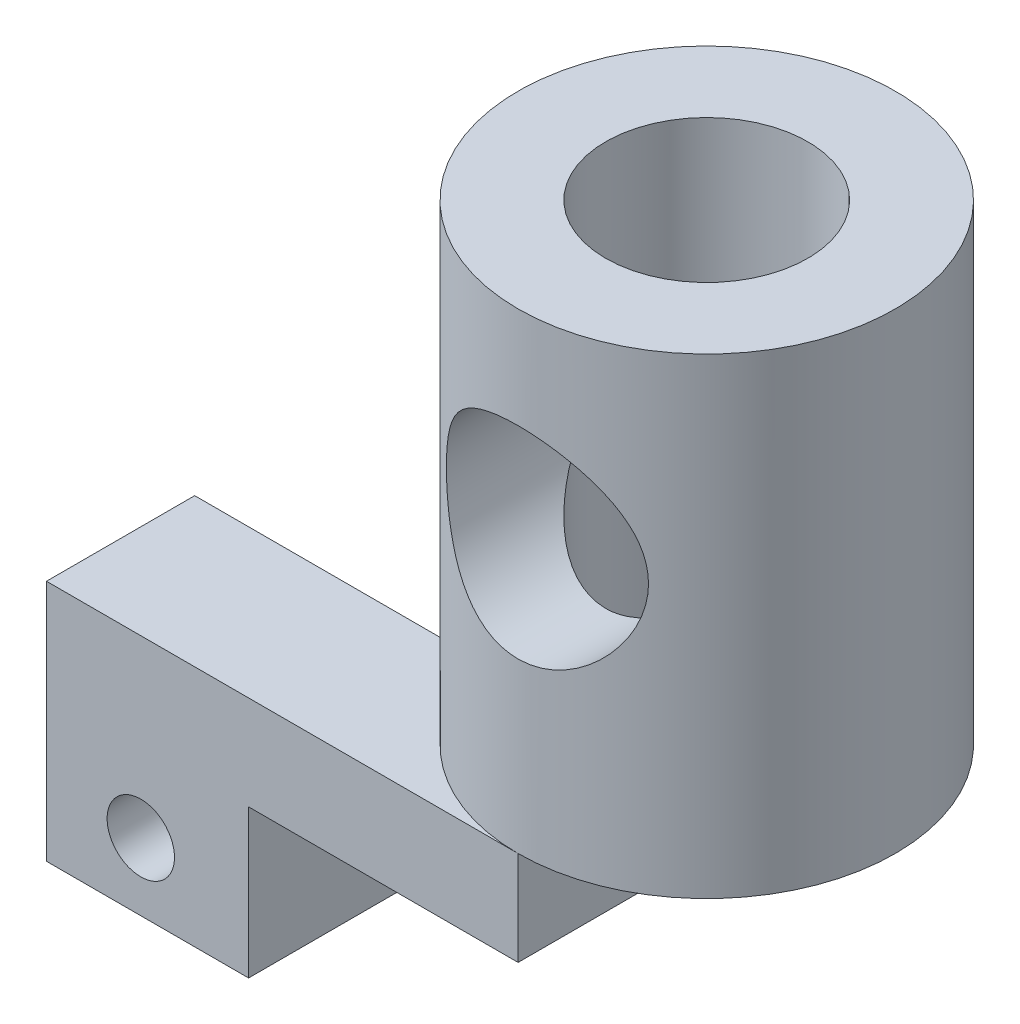
ISO-10303-21;
HEADER;
FILE_DESCRIPTION(('STEP AP214'),'2;1');
FILE_NAME('part.step','',(''),(''),'','','');
FILE_SCHEMA(('AUTOMOTIVE_DESIGN { 1 0 10303 214 1 1 1 1 }'));
ENDSEC;
DATA;
#1=APPLICATION_CONTEXT('core data for automotive mechanical design processes');
#2=APPLICATION_PROTOCOL_DEFINITION('international standard','automotive_design',2000,#1);
#3=PRODUCT_CONTEXT('',#1,'mechanical');
#4=PRODUCT('Part','Part','',(#3));
#5=PRODUCT_RELATED_PRODUCT_CATEGORY('part','',(#4));
#6=PRODUCT_DEFINITION_FORMATION('','',#4);
#7=PRODUCT_DEFINITION_CONTEXT('part definition',#1,'design');
#8=PRODUCT_DEFINITION('design','',#6,#7);
#9=PRODUCT_DEFINITION_SHAPE('','',#8);
#10=(LENGTH_UNIT() NAMED_UNIT(*) SI_UNIT(.MILLI.,.METRE.));
#11=(NAMED_UNIT(*) PLANE_ANGLE_UNIT() SI_UNIT($,.RADIAN.));
#12=(NAMED_UNIT(*) SI_UNIT($,.STERADIAN.) SOLID_ANGLE_UNIT());
#13=UNCERTAINTY_MEASURE_WITH_UNIT(LENGTH_MEASURE(1.E-05),#10,'distance_accuracy_value','');
#14=(GEOMETRIC_REPRESENTATION_CONTEXT(3) GLOBAL_UNCERTAINTY_ASSIGNED_CONTEXT((#13)) GLOBAL_UNIT_ASSIGNED_CONTEXT((#10,
#11,#12)) REPRESENTATION_CONTEXT('',''));
#15=CARTESIAN_POINT('',(0.,0.,0.));
#16=DIRECTION('',(0.,0.,1.));
#17=DIRECTION('',(1.,0.,0.));
#18=AXIS2_PLACEMENT_3D('',#15,#16,#17);
#19=CARTESIAN_POINT('',(0.,0.,14.));
#20=DIRECTION('',(0.,-1.,0.));
#21=DIRECTION('',(0.,0.,-1.));
#22=AXIS2_PLACEMENT_3D('',#19,#20,#21);
#23=PLANE('',#22);
#24=DIRECTION('',(-1.,0.,0.));
#25=VECTOR('',#24,1.);
#26=CARTESIAN_POINT('',(0.,0.,3.));
#27=LINE('',#26,#25);
#28=CARTESIAN_POINT('',(35.,0.,3.));
#29=VERTEX_POINT('',#28);
#30=CARTESIAN_POINT('',(28.1261364575662,0.,3.));
#31=VERTEX_POINT('',#30);
#32=EDGE_CURVE('E196',#29,#31,#27,.T.);
#33=ORIENTED_EDGE('',*,*,#32,.T.);
#34=CARTESIAN_POINT('',(35.,0.,0.));
#35=DIRECTION('',(0.,1.,0.));
#36=DIRECTION('',(0.,0.,1.));
#37=AXIS2_PLACEMENT_3D('',#34,#35,#36);
#38=CIRCLE('',#37,7.5);
#39=CARTESIAN_POINT('',(35.,0.,7.5));
#40=VERTEX_POINT('',#39);
#41=EDGE_CURVE('E63',#31,#40,#38,.T.);
#42=ORIENTED_EDGE('',*,*,#41,.T.);
#43=DIRECTION('',(0.,0.,-1.));
#44=VECTOR('',#43,1.);
#45=CARTESIAN_POINT('',(35.,0.,14.));
#46=LINE('',#45,#44);
#47=EDGE_CURVE('E218',#40,#29,#46,.T.);
#48=ORIENTED_EDGE('',*,*,#47,.T.);
#49=EDGE_LOOP('',(#33,#42,#48));
#50=FACE_BOUND('',#49,.T.);
#51=ADVANCED_FACE('F39',(#50),#23,.F.);
#52=CARTESIAN_POINT('',(0.,-18.,14.));
#53=DIRECTION('',(1.,0.,0.));
#54=DIRECTION('',(0.,1.,0.));
#55=AXIS2_PLACEMENT_3D('',#52,#53,#54);
#56=PLANE('',#55);
#57=DIRECTION('',(0.,-1.,0.));
#58=VECTOR('',#57,1.);
#59=CARTESIAN_POINT('',(0.,-18.,3.));
#60=LINE('',#59,#58);
#61=CARTESIAN_POINT('',(0.,0.,3.));
#62=VERTEX_POINT('',#61);
#63=CARTESIAN_POINT('',(0.,-18.,3.));
#64=VERTEX_POINT('',#63);
#65=EDGE_CURVE('E55',#62,#64,#60,.T.);
#66=ORIENTED_EDGE('',*,*,#65,.T.);
#67=DIRECTION('',(0.,0.,-1.));
#68=VECTOR('',#67,1.);
#69=CARTESIAN_POINT('',(0.,-18.,14.));
#70=LINE('',#69,#68);
#71=CARTESIAN_POINT('',(0.,-18.,14.));
#72=VERTEX_POINT('',#71);
#73=EDGE_CURVE('E124',#72,#64,#70,.T.);
#74=ORIENTED_EDGE('',*,*,#73,.F.);
#75=DIRECTION('',(0.,-1.,0.));
#76=VECTOR('',#75,1.);
#77=CARTESIAN_POINT('',(0.,-18.,14.));
#78=LINE('',#77,#76);
#79=CARTESIAN_POINT('',(0.,0.,14.));
#80=VERTEX_POINT('',#79);
#81=EDGE_CURVE('E203',#80,#72,#78,.T.);
#82=ORIENTED_EDGE('',*,*,#81,.F.);
#83=DIRECTION('',(0.,0.,-1.));
#84=VECTOR('',#83,1.);
#85=CARTESIAN_POINT('',(0.,0.,14.));
#86=LINE('',#85,#84);
#87=EDGE_CURVE('E126',#80,#62,#86,.T.);
#88=ORIENTED_EDGE('',*,*,#87,.T.);
#89=EDGE_LOOP('',(#66,#74,#82,#88));
#90=FACE_BOUND('',#89,.T.);
#91=ADVANCED_FACE('F122',(#90),#56,.F.);
#92=CARTESIAN_POINT('',(15.,-18.,14.));
#93=DIRECTION('',(0.,1.,0.));
#94=DIRECTION('',(-1.,0.,0.));
#95=AXIS2_PLACEMENT_3D('',#92,#93,#94);
#96=PLANE('',#95);
#97=DIRECTION('',(1.,0.,0.));
#98=VECTOR('',#97,1.);
#99=CARTESIAN_POINT('',(15.,-18.,3.));
#100=LINE('',#99,#98);
#101=CARTESIAN_POINT('',(15.,-18.,3.));
#102=VERTEX_POINT('',#101);
#103=EDGE_CURVE('E109',#64,#102,#100,.T.);
#104=ORIENTED_EDGE('',*,*,#103,.T.);
#105=DIRECTION('',(0.,0.,-1.));
#106=VECTOR('',#105,1.);
#107=CARTESIAN_POINT('',(15.,-18.,14.));
#108=LINE('',#107,#106);
#109=CARTESIAN_POINT('',(15.,-18.,14.));
#110=VERTEX_POINT('',#109);
#111=EDGE_CURVE('E133',#110,#102,#108,.T.);
#112=ORIENTED_EDGE('',*,*,#111,.F.);
#113=DIRECTION('',(1.,0.,0.));
#114=VECTOR('',#113,1.);
#115=CARTESIAN_POINT('',(15.,-18.,14.));
#116=LINE('',#115,#114);
#117=EDGE_CURVE('E130',#72,#110,#116,.T.);
#118=ORIENTED_EDGE('',*,*,#117,.F.);
#119=ORIENTED_EDGE('',*,*,#73,.T.);
#120=EDGE_LOOP('',(#104,#112,#118,#119));
#121=FACE_BOUND('',#120,.T.);
#122=ADVANCED_FACE('F129',(#121),#96,.F.);
#123=CARTESIAN_POINT('',(15.,-7.,14.));
#124=DIRECTION('',(-1.,0.,0.));
#125=DIRECTION('',(0.,-1.,0.));
#126=AXIS2_PLACEMENT_3D('',#123,#124,#125);
#127=PLANE('',#126);
#128=DIRECTION('',(0.,1.,0.));
#129=VECTOR('',#128,1.);
#130=CARTESIAN_POINT('',(15.,-7.,3.));
#131=LINE('',#130,#129);
#132=CARTESIAN_POINT('',(15.,-7.,3.));
#133=VERTEX_POINT('',#132);
#134=EDGE_CURVE('E113',#102,#133,#131,.T.);
#135=ORIENTED_EDGE('',*,*,#134,.T.);
#136=DIRECTION('',(0.,0.,-1.));
#137=VECTOR('',#136,1.);
#138=CARTESIAN_POINT('',(15.,-7.,14.));
#139=LINE('',#138,#137);
#140=CARTESIAN_POINT('',(15.,-7.,14.));
#141=VERTEX_POINT('',#140);
#142=EDGE_CURVE('E137',#141,#133,#139,.T.);
#143=ORIENTED_EDGE('',*,*,#142,.F.);
#144=DIRECTION('',(0.,1.,0.));
#145=VECTOR('',#144,1.);
#146=CARTESIAN_POINT('',(15.,-7.,14.));
#147=LINE('',#146,#145);
#148=EDGE_CURVE('E208',#110,#141,#147,.T.);
#149=ORIENTED_EDGE('',*,*,#148,.F.);
#150=ORIENTED_EDGE('',*,*,#111,.T.);
#151=EDGE_LOOP('',(#135,#143,#149,#150));
#152=FACE_BOUND('',#151,.T.);
#153=ADVANCED_FACE('F232',(#152),#127,.F.);
#154=CARTESIAN_POINT('',(35.,-7.,14.));
#155=DIRECTION('',(0.,1.,0.));
#156=DIRECTION('',(-1.,0.,0.));
#157=AXIS2_PLACEMENT_3D('',#154,#155,#156);
#158=PLANE('',#157);
#159=DIRECTION('',(1.,0.,0.));
#160=VECTOR('',#159,1.);
#161=CARTESIAN_POINT('',(35.,-7.,3.));
#162=LINE('',#161,#160);
#163=CARTESIAN_POINT('',(35.,-7.,3.));
#164=VERTEX_POINT('',#163);
#165=EDGE_CURVE('E198',#133,#164,#162,.T.);
#166=ORIENTED_EDGE('',*,*,#165,.T.);
#167=DIRECTION('',(0.,0.,-1.));
#168=VECTOR('',#167,1.);
#169=CARTESIAN_POINT('',(35.,-7.,14.));
#170=LINE('',#169,#168);
#171=CARTESIAN_POINT('',(35.,-7.,14.));
#172=VERTEX_POINT('',#171);
#173=EDGE_CURVE('E222',#172,#164,#170,.T.);
#174=ORIENTED_EDGE('',*,*,#173,.F.);
#175=DIRECTION('',(1.,0.,0.));
#176=VECTOR('',#175,1.);
#177=CARTESIAN_POINT('',(35.,-7.,14.));
#178=LINE('',#177,#176);
#179=EDGE_CURVE('E210',#141,#172,#178,.T.);
#180=ORIENTED_EDGE('',*,*,#179,.F.);
#181=ORIENTED_EDGE('',*,*,#142,.T.);
#182=EDGE_LOOP('',(#166,#174,#180,#181));
#183=FACE_BOUND('',#182,.T.);
#184=ADVANCED_FACE('F185',(#183),#158,.F.);
#185=CARTESIAN_POINT('',(35.,0.,14.));
#186=DIRECTION('',(-1.,0.,0.));
#187=DIRECTION('',(0.,0.,1.));
#188=AXIS2_PLACEMENT_3D('',#185,#186,#187);
#189=PLANE('',#188);
#190=DIRECTION('',(0.,1.,0.));
#191=VECTOR('',#190,1.);
#192=CARTESIAN_POINT('',(35.,0.,3.));
#193=LINE('',#192,#191);
#194=EDGE_CURVE('E194',#164,#29,#193,.T.);
#195=ORIENTED_EDGE('',*,*,#194,.T.);
#196=ORIENTED_EDGE('',*,*,#47,.F.);
#197=CARTESIAN_POINT('',(35.,0.,14.));
#198=VERTEX_POINT('',#197);
#199=EDGE_CURVE('E219',#198,#40,#46,.T.);
#200=ORIENTED_EDGE('',*,*,#199,.F.);
#201=DIRECTION('',(0.,1.,0.));
#202=VECTOR('',#201,1.);
#203=CARTESIAN_POINT('',(35.,0.,14.));
#204=LINE('',#203,#202);
#205=EDGE_CURVE('E212',#172,#198,#204,.T.);
#206=ORIENTED_EDGE('',*,*,#205,.F.);
#207=ORIENTED_EDGE('',*,*,#173,.T.);
#208=EDGE_LOOP('',(#195,#196,#200,#206,#207));
#209=FACE_BOUND('',#208,.T.);
#210=ADVANCED_FACE('F177',(#209),#189,.F.);
#211=CARTESIAN_POINT('',(21.3252056688227,0.,3.));
#212=VERTEX_POINT('',#211);
#213=EDGE_CURVE('E188',#212,#62,#27,.T.);
#214=ORIENTED_EDGE('',*,*,#213,.T.);
#215=ORIENTED_EDGE('',*,*,#87,.F.);
#216=DIRECTION('',(-1.,0.,0.));
#217=VECTOR('',#216,1.);
#218=CARTESIAN_POINT('',(0.,0.,14.));
#219=LINE('',#218,#217);
#220=EDGE_CURVE('E215',#198,#80,#219,.T.);
#221=ORIENTED_EDGE('',*,*,#220,.F.);
#222=CARTESIAN_POINT('',(35.,0.,0.));
#223=DIRECTION('',(0.,1.,0.));
#224=DIRECTION('',(0.,0.,1.));
#225=AXIS2_PLACEMENT_3D('',#222,#223,#224);
#226=CIRCLE('',#225,14.);
#227=EDGE_CURVE('E190',#212,#198,#226,.T.);
#228=ORIENTED_EDGE('',*,*,#227,.F.);
#229=EDGE_LOOP('',(#214,#215,#221,#228));
#230=FACE_BOUND('',#229,.T.);
#231=ADVANCED_FACE('F169',(#230),#23,.F.);
#232=CARTESIAN_POINT('',(7.,-13.,14.));
#233=DIRECTION('',(0.,0.,-1.));
#234=DIRECTION('',(-1.,0.,0.));
#235=AXIS2_PLACEMENT_3D('',#232,#233,#234);
#236=CYLINDRICAL_SURFACE('',#235,2.5);
#237=CARTESIAN_POINT('',(7.,-13.,14.));
#238=DIRECTION('',(0.,0.,1.));
#239=DIRECTION('',(1.,0.,0.));
#240=AXIS2_PLACEMENT_3D('',#237,#238,#239);
#241=CIRCLE('',#240,2.5);
#242=CARTESIAN_POINT('',(9.5,-13.,14.));
#243=VERTEX_POINT('',#242);
#244=EDGE_CURVE('E201',#243,#243,#241,.T.);
#245=ORIENTED_EDGE('',*,*,#244,.T.);
#246=EDGE_LOOP('',(#245));
#247=FACE_BOUND('',#246,.T.);
#248=CARTESIAN_POINT('',(7.,-13.,3.));
#249=DIRECTION('',(0.,0.,1.));
#250=DIRECTION('',(1.,0.,0.));
#251=AXIS2_PLACEMENT_3D('',#248,#249,#250);
#252=CIRCLE('',#251,2.5);
#253=CARTESIAN_POINT('',(9.5,-13.,3.));
#254=VERTEX_POINT('',#253);
#255=EDGE_CURVE('E127',#254,#254,#252,.T.);
#256=ORIENTED_EDGE('',*,*,#255,.F.);
#257=EDGE_LOOP('',(#256));
#258=FACE_BOUND('',#257,.T.);
#259=ADVANCED_FACE('F176',(#247,#258),#236,.F.);
#260=CARTESIAN_POINT('',(35.,35.,0.));
#261=DIRECTION('',(0.,-1.,0.));
#262=DIRECTION('',(0.,0.,-1.));
#263=AXIS2_PLACEMENT_3D('',#260,#261,#262);
#264=CYLINDRICAL_SURFACE('',#263,14.);
#265=CARTESIAN_POINT('',(35.,35.,0.));
#266=DIRECTION('',(0.,1.,0.));
#267=DIRECTION('',(0.,0.,1.));
#268=AXIS2_PLACEMENT_3D('',#265,#266,#267);
#269=CIRCLE('',#268,14.);
#270=CARTESIAN_POINT('',(35.,35.,14.));
#271=VERTEX_POINT('',#270);
#272=EDGE_CURVE('E254',#271,#271,#269,.T.);
#273=ORIENTED_EDGE('',*,*,#272,.F.);
#274=EDGE_LOOP('',(#273));
#275=FACE_BOUND('',#274,.T.);
#276=EDGE_CURVE('E251',#198,#212,#226,.T.);
#277=ORIENTED_EDGE('',*,*,#276,.T.);
#278=ORIENTED_EDGE('',*,*,#227,.T.);
#279=EDGE_LOOP('',(#277,#278));
#280=FACE_BOUND('',#279,.T.);
#281=CARTESIAN_POINT('',(27.5,20.,11.8215904175369));
#282=CARTESIAN_POINT('',(27.4999990589855,19.806768604071,11.82158924254));
#283=CARTESIAN_POINT('',(27.5074767769572,19.613547850116,11.8263437300954));
#284=CARTESIAN_POINT('',(27.5372741725406,19.2286413534503,11.8451692310046));
#285=CARTESIAN_POINT('',(27.5595993310484,19.0369562040593,11.8592436847926));
#286=CARTESIAN_POINT('',(27.6188052002818,18.6564645448089,11.8961832266942));
#287=CARTESIAN_POINT('',(27.6557047525107,18.4676620911177,11.9190596928911));
#288=CARTESIAN_POINT('',(27.7435801030353,18.0944435994979,11.9727614449499));
#289=CARTESIAN_POINT('',(27.7945621439531,17.9100295463716,12.0035902556023));
#290=CARTESIAN_POINT('',(27.9096257428336,17.5479711712402,12.0719109087049));
#291=CARTESIAN_POINT('',(27.9736207952273,17.3702908908122,12.1093585471128));
#292=CARTESIAN_POINT('',(28.1143081233628,17.021297726479,12.1899064259315));
#293=CARTESIAN_POINT('',(28.1910050511526,16.8499872037439,12.2330087361532));
#294=CARTESIAN_POINT('',(28.3564652536056,16.5145441012143,12.3236491146825));
#295=CARTESIAN_POINT('',(28.4452268950537,16.350410553832,12.3711865823247));
#296=CARTESIAN_POINT('',(28.6341993428717,16.0299586373999,12.4694811555299));
#297=CARTESIAN_POINT('',(28.7344105391963,15.8736405347933,12.5202383707265));
#298=CARTESIAN_POINT('',(29.0717182167373,15.388058321219,12.6854923670964));
#299=CARTESIAN_POINT('',(29.3298519664732,15.0742469605895,12.8039916210198));
#300=CARTESIAN_POINT('',(29.7523158616945,14.6378192754687,12.9801872692607));
#301=CARTESIAN_POINT('',(29.8991176026319,14.4979812944868,13.0386965132516));
#302=CARTESIAN_POINT('',(30.2040457785556,14.2302564242928,13.1539097894118));
#303=CARTESIAN_POINT('',(30.3621740446301,14.1023714751896,13.2106135275464));
#304=CARTESIAN_POINT('',(30.7021993160464,13.8496059299829,13.3253012106534));
#305=CARTESIAN_POINT('',(30.8849847852584,13.7257987968556,13.383019797524));
#306=CARTESIAN_POINT('',(31.2618647469785,13.4942157668861,13.4931411587737));
#307=CARTESIAN_POINT('',(31.4559542839235,13.3864329177308,13.5455462353213));
#308=CARTESIAN_POINT('',(31.8542699723965,13.1879609310866,13.643549014948));
#309=CARTESIAN_POINT('',(32.0584930345612,13.0972666238495,13.6891487759491));
#310=CARTESIAN_POINT('',(32.4756702444358,12.9340316131421,13.7721809250184));
#311=CARTESIAN_POINT('',(32.6886232972417,12.8614886412125,13.8096143335998));
#312=CARTESIAN_POINT('',(33.104263666187,12.7405767285424,13.8725189382145));
#313=CARTESIAN_POINT('',(33.3064167351534,12.6907420611251,13.8987056736891));
#314=CARTESIAN_POINT('',(33.7150761523742,12.6079486304493,13.9424238900049));
#315=CARTESIAN_POINT('',(33.9215822882778,12.5749890459671,13.9599557920311));
#316=CARTESIAN_POINT('',(34.3370734436854,12.5264298080594,13.9858438958024));
#317=CARTESIAN_POINT('',(34.5460569078964,12.5108197910713,13.9942055752339));
#318=CARTESIAN_POINT('',(34.964755415329,12.4971591504375,14.0015208025305));
#319=CARTESIAN_POINT('',(35.1744704035491,12.4991072339266,14.0004750430987));
#320=CARTESIAN_POINT('',(35.5718439966255,12.5194559644125,13.9895847286427));
#321=CARTESIAN_POINT('',(35.7596149223951,12.5361951265238,13.9806287712972));
#322=CARTESIAN_POINT('',(36.1329398587043,12.5836759626681,13.9553379454909));
#323=CARTESIAN_POINT('',(36.3184931070116,12.6144223166639,13.9390006108427));
#324=CARTESIAN_POINT('',(36.6859801272297,12.6895530307173,13.8993387899878));
#325=CARTESIAN_POINT('',(36.867915141698,12.7339326196912,13.8760167482191));
#326=CARTESIAN_POINT('',(37.2271525964881,12.8358761054452,13.8229077838052));
#327=CARTESIAN_POINT('',(37.40445320132,12.8934451404222,13.7931183419));
#328=CARTESIAN_POINT('',(37.7553308774444,13.0219308811495,13.727358255508));
#329=CARTESIAN_POINT('',(37.9288424994014,13.0929922052302,13.6913210457523));
#330=CARTESIAN_POINT('',(38.2691449660572,13.2473975734341,13.614080460369));
#331=CARTESIAN_POINT('',(38.4359335289464,13.3307457437574,13.5728753499402));
#332=CARTESIAN_POINT('',(38.9249515325987,13.5982271432735,13.442778576015));
#333=CARTESIAN_POINT('',(39.2360465952592,13.7998761545197,13.3473639029725));
#334=CARTESIAN_POINT('',(39.8538570350863,14.2680183574708,13.1361160826789));
#335=CARTESIAN_POINT('',(40.1567390392609,14.5390786336004,13.0191913143723));
#336=CARTESIAN_POINT('',(40.5751397685995,14.9791519876798,12.8429309636078));
#337=CARTESIAN_POINT('',(40.7087140317334,15.1315618250788,12.7839834665736));
#338=CARTESIAN_POINT('',(40.9633405408786,15.44701885264,12.6672079013068));
#339=CARTESIAN_POINT('',(41.0843906442649,15.6100678551886,12.6093800259894));
#340=CARTESIAN_POINT('',(41.3225004536957,15.9596697185115,12.4917984687544));
#341=CARTESIAN_POINT('',(41.4384466862298,16.1470571112161,12.4322669574827));
#342=CARTESIAN_POINT('',(41.6539166620692,16.5324222806281,12.3182890354374));
#343=CARTESIAN_POINT('',(41.7534478095067,16.7303952289961,12.2638403368637));
#344=CARTESIAN_POINT('',(41.9350988816375,17.1357895217505,12.1620412127541));
#345=CARTESIAN_POINT('',(42.0172301104651,17.3432046248093,12.1146861845968));
#346=CARTESIAN_POINT('',(42.1631143169955,17.7662093238331,12.0290051636502));
#347=CARTESIAN_POINT('',(42.2268701463449,17.9817976455281,11.9906777700466));
#348=CARTESIAN_POINT('',(42.3306340287287,18.401656291435,11.927497288373));
#349=CARTESIAN_POINT('',(42.3721480542369,18.6054276580469,11.9018038661284));
#350=CARTESIAN_POINT('',(42.4381824659351,19.0167351134861,11.8606478148504));
#351=CARTESIAN_POINT('',(42.4627039036103,19.2242709685548,11.8451845527873));
#352=CARTESIAN_POINT('',(42.4943155215533,19.6410176388,11.8252098231004));
#353=CARTESIAN_POINT('',(42.5014204786644,19.8502268828817,11.8206890714514));
#354=CARTESIAN_POINT('',(42.4981101201728,20.2684399473694,11.8227895612752));
#355=CARTESIAN_POINT('',(42.4876964678092,20.477443785392,11.8294097450135));
#356=CARTESIAN_POINT('',(42.4521223529846,20.8651652858596,11.8518450685446));
#357=CARTESIAN_POINT('',(42.4291390173972,21.0441676631644,11.8663004138869));
#358=CARTESIAN_POINT('',(42.3704960958227,21.3993544907123,11.9028140107268));
#359=CARTESIAN_POINT('',(42.3348324101323,21.5755380103122,11.9248747210564));
#360=CARTESIAN_POINT('',(42.2512479929245,21.9239274455067,11.975883814004));
#361=CARTESIAN_POINT('',(42.2033281035326,22.0961336334984,12.004831723392));
#362=CARTESIAN_POINT('',(42.095698568208,22.4357353241165,12.0687603692438));
#363=CARTESIAN_POINT('',(42.035984207681,22.603128872238,12.1037435174586));
#364=CARTESIAN_POINT('',(41.9024448246756,22.9394567929921,12.1804119466031));
#365=CARTESIAN_POINT('',(41.8281181140534,23.1081401695489,12.222322929887));
#366=CARTESIAN_POINT('',(41.6677602906154,23.4387114473089,12.3105380138941));
#367=CARTESIAN_POINT('',(41.5817252852266,23.6005970649879,12.3568435740947));
#368=CARTESIAN_POINT('',(41.3985002502254,23.9169653758495,12.4527058991705));
#369=CARTESIAN_POINT('',(41.3013076526458,24.071446353179,12.5022634113673));
#370=CARTESIAN_POINT('',(41.0962934040336,24.3724560645473,12.6035026203796));
#371=CARTESIAN_POINT('',(40.9884710200506,24.5189842491394,12.6551844635295));
#372=CARTESIAN_POINT('',(40.7458515274458,24.8248054087289,12.7673648870848));
#373=CARTESIAN_POINT('',(40.6094283866613,24.9827506447924,12.8280304926216));
#374=CARTESIAN_POINT('',(40.3238595284633,25.2867778431851,12.9491535150541));
#375=CARTESIAN_POINT('',(40.1747132599096,25.4328592910634,13.009610922813));
#376=CARTESIAN_POINT('',(39.8643018917425,25.7124614665514,13.1288315477483));
#377=CARTESIAN_POINT('',(39.7030311948655,25.8459763279266,13.1875939648927));
#378=CARTESIAN_POINT('',(39.369139865309,26.0995547299802,13.3019457112866));
#379=CARTESIAN_POINT('',(39.1965177585685,26.2196165181862,13.3575346266764));
#380=CARTESIAN_POINT('',(38.8330813207364,26.4502540681844,13.4664397613164));
#381=CARTESIAN_POINT('',(38.6418033542367,26.5601966612771,13.5195543042812));
#382=CARTESIAN_POINT('',(38.2490346090234,26.763329605492,13.6192804566703));
#383=CARTESIAN_POINT('',(38.0475487437852,26.8565279199247,13.6658951549423));
#384=CARTESIAN_POINT('',(37.6357658076833,27.0251123204226,13.7512515937092));
#385=CARTESIAN_POINT('',(37.4254736168485,27.1005081219164,13.7899976267757));
#386=CARTESIAN_POINT('',(36.9976502749829,27.2325297641327,13.8584376823857));
#387=CARTESIAN_POINT('',(36.7801201412663,27.2891582304988,13.8881329711267));
#388=CARTESIAN_POINT('',(36.3616544125149,27.3781438565327,13.9350540021846));
#389=CARTESIAN_POINT('',(36.1612171840023,27.4123533843287,13.9532254690613));
#390=CARTESIAN_POINT('',(35.7576387921626,27.4644067382299,13.9809470038195));
#391=CARTESIAN_POINT('',(35.5544978125991,27.4822516708699,13.9904976546193));
#392=CARTESIAN_POINT('',(35.1472951861036,27.5013222216413,14.0007060814777));
#393=CARTESIAN_POINT('',(34.9432339333433,27.5025543833847,14.0013673589752));
#394=CARTESIAN_POINT('',(34.5358599178406,27.4883981141912,13.9937868071425));
#395=CARTESIAN_POINT('',(34.3325471235721,27.4730103915331,13.985545357214));
#396=CARTESIAN_POINT('',(33.9450939194816,27.4277869047026,13.9614358063944));
#397=CARTESIAN_POINT('',(33.7607570949122,27.3992496177715,13.9462539398323));
#398=CARTESIAN_POINT('',(33.3953351098932,27.3286894252637,13.9089464445683));
#399=CARTESIAN_POINT('',(33.2142510650567,27.2866619827923,13.8868184798688));
#400=CARTESIAN_POINT('',(32.8566001214114,27.1895871725244,13.8361285064774));
#401=CARTESIAN_POINT('',(32.6800318323277,27.1345438667491,13.8075685052426));
#402=CARTESIAN_POINT('',(32.3322976096499,27.0119448288354,13.744620925288));
#403=CARTESIAN_POINT('',(32.1611338117781,26.9443842208391,13.7102310761159));
#404=CARTESIAN_POINT('',(31.8189539884048,26.7946369347182,13.6349823353638));
#405=CARTESIAN_POINT('',(31.6481756700416,26.7120031530681,13.5939318093401));
#406=CARTESIAN_POINT('',(31.3142392838895,26.5345962874842,13.5072193977632));
#407=CARTESIAN_POINT('',(31.1510838278257,26.4398190840253,13.4615559484426));
#408=CARTESIAN_POINT('',(30.6741789816983,26.1382944203552,13.3190520635327));
#409=CARTESIAN_POINT('',(30.3728171975351,25.914277140129,13.2166583607824));
#410=CARTESIAN_POINT('',(29.7766761973301,25.3980722977472,12.9934284655169));
#411=CARTESIAN_POINT('',(29.4863432249768,25.1010773242457,12.8718068954639));
#412=CARTESIAN_POINT('',(29.0900470947146,24.6222852079623,12.6922669397368));
#413=CARTESIAN_POINT('',(28.9643842346676,24.4569695199135,12.6328487359138));
#414=CARTESIAN_POINT('',(28.7267732115209,24.1158010344306,12.5165527475857));
#415=CARTESIAN_POINT('',(28.614827300851,23.9399465134791,12.4596753812775));
#416=CARTESIAN_POINT('',(28.399597745863,23.5683809358798,12.3470754905127));
#417=CARTESIAN_POINT('',(28.2971522644368,23.3721093793275,12.2915967195112));
#418=CARTESIAN_POINT('',(28.1094955566292,22.9698758434101,12.1873897085273));
#419=CARTESIAN_POINT('',(28.0242755087692,22.7639188910807,12.1386580172831));
#420=CARTESIAN_POINT('',(27.8722323668579,22.3440660582873,12.0500068876332));
#421=CARTESIAN_POINT('',(27.8053638295623,22.1301913041328,12.0100657310428));
#422=CARTESIAN_POINT('',(27.6907879820046,21.6958233033683,11.9406834796418));
#423=CARTESIAN_POINT('',(27.6430680529186,21.4753345186851,11.9112354713442));
#424=CARTESIAN_POINT('',(27.5704245632724,21.0464677642894,11.8660480352631));
#425=CARTESIAN_POINT('',(27.5440570973996,20.8384252289775,11.8494445629041));
#426=CARTESIAN_POINT('',(27.5088450503848,20.4202509785354,11.8272162193321));
#427=CARTESIAN_POINT('',(27.5000010232562,20.2101191975637,11.8215916952248));
#428=CARTESIAN_POINT('',(27.5,20.,11.8215904175369));
#429=B_SPLINE_CURVE_WITH_KNOTS('',3,(#281,#282,#283,#284,#285,#286,#287,#288,#289,#290,#291,
#292,#293,#294,#295,#296,#297,#298,#299,#300,#301,#302,#303,#304,#305,#306,#307,#308,#309,#310,
#311,#312,#313,#314,#315,#316,#317,#318,#319,#320,#321,#322,#323,#324,#325,#326,#327,#328,#329,
#330,#331,#332,#333,#334,#335,#336,#337,#338,#339,#340,#341,#342,#343,#344,#345,#346,#347,#348,
#349,#350,#351,#352,#353,#354,#355,#356,#357,#358,#359,#360,#361,#362,#363,#364,#365,#366,#367,
#368,#369,#370,#371,#372,#373,#374,#375,#376,#377,#378,#379,#380,#381,#382,#383,#384,#385,#386,
#387,#388,#389,#390,#391,#392,#393,#394,#395,#396,#397,#398,#399,#400,#401,#402,#403,#404,#405,
#406,#407,#408,#409,#410,#411,#412,#413,#414,#415,#416,#417,#418,#419,#420,#421,#422,#423,#424,
#425,#426,#427,#428),.UNSPECIFIED.,.T.,.F.,(4,2,2,2,2,2,2,2,2,2,2,2,2,2,2,2,2,2,2,2,2,2,2,2,2,2,
2,2,2,2,2,2,2,2,2,2,2,2,2,2,2,2,2,2,2,2,2,2,2,2,2,2,2,2,2,2,2,2,2,2,2,2,2,2,2,2,2,2,2,2,2,2,2,
4),(0.,0.579475181027557,1.15916439271105,1.73960548160665,2.32030428812845,2.89726211651638,
3.47443172429443,4.05152327758628,4.62863449161412,5.89220772122156,6.52478888650155,
7.15747254902394,7.84116458824744,8.52455912900249,9.20774659121837,9.89084862953606,
10.5195152417827,11.148151257137,11.7764115619091,12.4046256060188,12.9701395593619,
13.5358425961043,14.1013478846459,14.667073852149,15.2392461134551,15.8116109626968,
16.955654520265,18.2188950446558,18.8515498221366,19.484312655435,20.1682230564527,
20.8518241264619,21.5349797129265,22.2180292244932,22.8457158528188,23.4733636370259,
24.1004787149901,24.7275342572136,25.2700616414789,25.812764590834,26.3554302610034,
26.8983132910848,27.4648646733805,28.0316048752229,28.598475777225,29.1653857937715,
29.8167033690725,30.4680491724759,31.1196975394076,31.7714306952423,32.4512960170704,
33.1308371449814,33.8100065629136,34.489080921512,35.1006912926067,35.7122603050228,
36.3235884192034,36.9348904818426,37.4956960339254,38.0566903893368,38.617509898837,
39.1785483251029,39.7602537431487,40.3421570235896,41.5053871144954,42.7977753150929,
43.4451681904756,44.092667230747,44.7764876860546,45.4599570513822,46.1417183713877,
46.8230296738053,47.4531291986221,48.0832486440681),.UNSPECIFIED.);
#430=CARTESIAN_POINT('',(27.5,20.,11.8215904175369));
#431=VERTEX_POINT('',#430);
#432=EDGE_CURVE('E132',#431,#431,#429,.T.);
#433=ORIENTED_EDGE('',*,*,#432,.F.);
#434=EDGE_LOOP('',(#433));
#435=FACE_BOUND('',#434,.T.);
#436=ADVANCED_FACE('F41',(#275,#280,#435),#264,.T.);
#437=CARTESIAN_POINT('',(35.,35.,0.));
#438=DIRECTION('',(0.,-1.,0.));
#439=DIRECTION('',(0.,0.,-1.));
#440=AXIS2_PLACEMENT_3D('',#437,#438,#439);
#441=CYLINDRICAL_SURFACE('',#440,7.5);
#442=CARTESIAN_POINT('',(35.,35.,0.));
#443=DIRECTION('',(0.,1.,0.));
#444=DIRECTION('',(0.,0.,1.));
#445=AXIS2_PLACEMENT_3D('',#442,#443,#444);
#446=CIRCLE('',#445,7.5);
#447=CARTESIAN_POINT('',(35.,35.,7.5));
#448=VERTEX_POINT('',#447);
#449=EDGE_CURVE('E145',#448,#448,#446,.T.);
#450=ORIENTED_EDGE('',*,*,#449,.T.);
#451=EDGE_LOOP('',(#450));
#452=FACE_BOUND('',#451,.T.);
#453=EDGE_CURVE('E271',#40,#31,#38,.T.);
#454=ORIENTED_EDGE('',*,*,#453,.F.);
#455=ORIENTED_EDGE('',*,*,#41,.F.);
#456=EDGE_LOOP('',(#454,#455));
#457=FACE_BOUND('',#456,.T.);
#458=CARTESIAN_POINT('',(35.,20.,0.));
#459=DIRECTION('',(0.,-0.707106781186547,0.707106781186547));
#460=DIRECTION('',(0.,-0.707106781186547,-0.707106781186547));
#461=AXIS2_PLACEMENT_3D('',#458,#459,#460);
#462=ELLIPSE('',#461,10.6066017177982,7.5);
#463=CARTESIAN_POINT('',(42.5,20.,0.));
#464=VERTEX_POINT('',#463);
#465=CARTESIAN_POINT('',(27.5,20.,0.));
#466=VERTEX_POINT('',#465);
#467=EDGE_CURVE('E48',#464,#466,#462,.T.);
#468=ORIENTED_EDGE('',*,*,#467,.T.);
#469=CARTESIAN_POINT('',(35.,20.,0.));
#470=DIRECTION('',(0.,-0.707106781186547,-0.707106781186547));
#471=DIRECTION('',(0.,-0.707106781186547,0.707106781186547));
#472=AXIS2_PLACEMENT_3D('',#469,#470,#471);
#473=ELLIPSE('',#472,10.6066017177982,7.5);
#474=EDGE_CURVE('E11',#466,#464,#473,.F.);
#475=ORIENTED_EDGE('',*,*,#474,.T.);
#476=EDGE_LOOP('',(#468,#475));
#477=FACE_BOUND('',#476,.T.);
#478=ADVANCED_FACE('F156',(#452,#457,#477),#441,.F.);
#479=CARTESIAN_POINT('',(35.,35.,0.));
#480=DIRECTION('',(0.,1.,0.));
#481=DIRECTION('',(0.,0.,1.));
#482=AXIS2_PLACEMENT_3D('',#479,#480,#481);
#483=PLANE('',#482);
#484=ORIENTED_EDGE('',*,*,#272,.T.);
#485=EDGE_LOOP('',(#484));
#486=FACE_BOUND('',#485,.T.);
#487=ORIENTED_EDGE('',*,*,#449,.F.);
#488=EDGE_LOOP('',(#487));
#489=FACE_BOUND('',#488,.T.);
#490=ADVANCED_FACE('F159',(#486,#489),#483,.T.);
#491=CARTESIAN_POINT('',(35.,0.,0.));
#492=DIRECTION('',(0.,1.,0.));
#493=DIRECTION('',(0.,0.,1.));
#494=AXIS2_PLACEMENT_3D('',#491,#492,#493);
#495=PLANE('',#494);
#496=ORIENTED_EDGE('',*,*,#453,.T.);
#497=EDGE_CURVE('E193',#31,#212,#27,.T.);
#498=ORIENTED_EDGE('',*,*,#497,.T.);
#499=ORIENTED_EDGE('',*,*,#276,.F.);
#500=ORIENTED_EDGE('',*,*,#199,.T.);
#501=EDGE_LOOP('',(#496,#498,#499,#500));
#502=FACE_BOUND('',#501,.T.);
#503=ADVANCED_FACE('F153',(#502),#495,.F.);
#504=CARTESIAN_POINT('',(35.,20.,35.));
#505=DIRECTION('',(0.,0.,-1.));
#506=DIRECTION('',(-1.,0.,0.));
#507=AXIS2_PLACEMENT_3D('',#504,#505,#506);
#508=CYLINDRICAL_SURFACE('',#507,7.5);
#509=ORIENTED_EDGE('',*,*,#467,.F.);
#510=ORIENTED_EDGE('',*,*,#474,.F.);
#511=EDGE_LOOP('',(#509,#510));
#512=FACE_BOUND('',#511,.T.);
#513=ORIENTED_EDGE('',*,*,#432,.T.);
#514=EDGE_LOOP('',(#513));
#515=FACE_BOUND('',#514,.T.);
#516=ADVANCED_FACE('F147',(#512,#515),#508,.F.);
#517=CARTESIAN_POINT('',(0.,0.,14.));
#518=DIRECTION('',(0.,0.,-1.));
#519=DIRECTION('',(-1.,0.,0.));
#520=AXIS2_PLACEMENT_3D('',#517,#518,#519);
#521=PLANE('',#520);
#522=ORIENTED_EDGE('',*,*,#81,.T.);
#523=ORIENTED_EDGE('',*,*,#117,.T.);
#524=ORIENTED_EDGE('',*,*,#148,.T.);
#525=ORIENTED_EDGE('',*,*,#179,.T.);
#526=ORIENTED_EDGE('',*,*,#205,.T.);
#527=ORIENTED_EDGE('',*,*,#220,.T.);
#528=EDGE_LOOP('',(#522,#523,#524,#525,#526,#527));
#529=FACE_BOUND('',#528,.T.);
#530=ORIENTED_EDGE('',*,*,#244,.F.);
#531=EDGE_LOOP('',(#530));
#532=FACE_BOUND('',#531,.T.);
#533=ADVANCED_FACE('F152',(#529,#532),#521,.F.);
#534=CARTESIAN_POINT('',(0.,0.,3.));
#535=DIRECTION('',(0.,0.,-1.));
#536=DIRECTION('',(-1.,0.,0.));
#537=AXIS2_PLACEMENT_3D('',#534,#535,#536);
#538=PLANE('',#537);
#539=ORIENTED_EDGE('',*,*,#65,.F.);
#540=ORIENTED_EDGE('',*,*,#213,.F.);
#541=ORIENTED_EDGE('',*,*,#497,.F.);
#542=ORIENTED_EDGE('',*,*,#32,.F.);
#543=ORIENTED_EDGE('',*,*,#194,.F.);
#544=ORIENTED_EDGE('',*,*,#165,.F.);
#545=ORIENTED_EDGE('',*,*,#134,.F.);
#546=ORIENTED_EDGE('',*,*,#103,.F.);
#547=EDGE_LOOP('',(#539,#540,#541,#542,#543,#544,#545,#546));
#548=FACE_BOUND('',#547,.T.);
#549=ORIENTED_EDGE('',*,*,#255,.T.);
#550=EDGE_LOOP('',(#549));
#551=FACE_BOUND('',#550,.T.);
#552=ADVANCED_FACE('F110',(#548,#551),#538,.T.);
#553=CLOSED_SHELL('',(#51,#91,#122,#153,#184,#210,#231,#259,#436,#478,#490,#503,#516,#533,#552));
#554=MANIFOLD_SOLID_BREP('B2',#553);
#555=ADVANCED_BREP_SHAPE_REPRESENTATION('',(#18,#554),#14);
#556=SHAPE_DEFINITION_REPRESENTATION(#9,#555);
ENDSEC;
END-ISO-10303-21;
